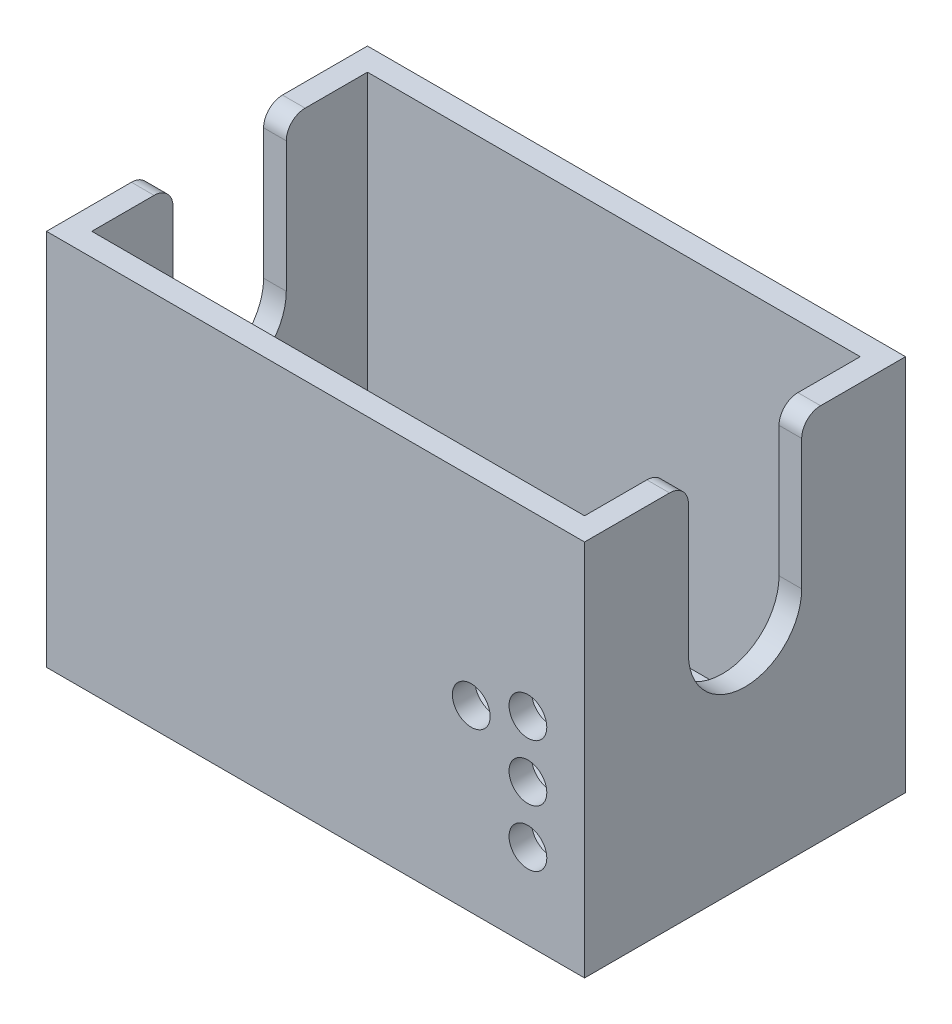
ISO-10303-21;
HEADER;
FILE_DESCRIPTION(('STEP AP214'),'2;1');
FILE_NAME('part.step','',(''),(''),'','','');
FILE_SCHEMA(('AUTOMOTIVE_DESIGN { 1 0 10303 214 1 1 1 1 }'));
ENDSEC;
DATA;
#1=APPLICATION_CONTEXT('core data for automotive mechanical design processes');
#2=APPLICATION_PROTOCOL_DEFINITION('international standard','automotive_design',2000,#1);
#3=PRODUCT_CONTEXT('',#1,'mechanical');
#4=PRODUCT('Part','Part','',(#3));
#5=PRODUCT_RELATED_PRODUCT_CATEGORY('part','',(#4));
#6=PRODUCT_DEFINITION_FORMATION('','',#4);
#7=PRODUCT_DEFINITION_CONTEXT('part definition',#1,'design');
#8=PRODUCT_DEFINITION('design','',#6,#7);
#9=PRODUCT_DEFINITION_SHAPE('','',#8);
#10=(LENGTH_UNIT() NAMED_UNIT(*) SI_UNIT(.MILLI.,.METRE.));
#11=(NAMED_UNIT(*) PLANE_ANGLE_UNIT() SI_UNIT($,.RADIAN.));
#12=(NAMED_UNIT(*) SI_UNIT($,.STERADIAN.) SOLID_ANGLE_UNIT());
#13=UNCERTAINTY_MEASURE_WITH_UNIT(LENGTH_MEASURE(1.E-05),#10,'distance_accuracy_value','');
#14=(GEOMETRIC_REPRESENTATION_CONTEXT(3) GLOBAL_UNCERTAINTY_ASSIGNED_CONTEXT((#13)) GLOBAL_UNIT_ASSIGNED_CONTEXT((#10,
#11,#12)) REPRESENTATION_CONTEXT('',''));
#15=CARTESIAN_POINT('',(0.,0.,0.));
#16=DIRECTION('',(0.,0.,1.));
#17=DIRECTION('',(1.,0.,0.));
#18=AXIS2_PLACEMENT_3D('',#15,#16,#17);
#19=CARTESIAN_POINT('',(0.,200.,0.));
#20=DIRECTION('',(0.,-1.,0.));
#21=DIRECTION('',(0.,0.,-1.));
#22=AXIS2_PLACEMENT_3D('',#19,#20,#21);
#23=PLANE('',#22);
#24=DIRECTION('',(1.,0.,0.));
#25=VECTOR('',#24,1.);
#26=CARTESIAN_POINT('',(-142.5,200.,40.0000000000001));
#27=LINE('',#26,#25);
#28=CARTESIAN_POINT('',(-142.5,200.,40.0000000000001));
#29=VERTEX_POINT('',#28);
#30=CARTESIAN_POINT('',(-130.5,200.,40.0000000000001));
#31=VERTEX_POINT('',#30);
#32=EDGE_CURVE('E291',#29,#31,#27,.T.);
#33=ORIENTED_EDGE('',*,*,#32,.F.);
#34=DIRECTION('',(0.,0.,1.));
#35=VECTOR('',#34,1.);
#36=CARTESIAN_POINT('',(-142.5,200.,-85.));
#37=LINE('',#36,#35);
#38=CARTESIAN_POINT('',(-142.5,200.,85.));
#39=VERTEX_POINT('',#38);
#40=EDGE_CURVE('E204',#29,#39,#37,.T.);
#41=ORIENTED_EDGE('',*,*,#40,.T.);
#42=DIRECTION('',(1.,0.,0.));
#43=VECTOR('',#42,1.);
#44=CARTESIAN_POINT('',(142.5,200.,84.9999999999999));
#45=LINE('',#44,#43);
#46=CARTESIAN_POINT('',(142.5,200.,84.9999999999999));
#47=VERTEX_POINT('',#46);
#48=EDGE_CURVE('E203',#39,#47,#45,.T.);
#49=ORIENTED_EDGE('',*,*,#48,.T.);
#50=DIRECTION('',(0.,0.,-1.));
#51=VECTOR('',#50,1.);
#52=CARTESIAN_POINT('',(142.5,200.,-85.0000000000001));
#53=LINE('',#52,#51);
#54=CARTESIAN_POINT('',(142.5,200.,40.));
#55=VERTEX_POINT('',#54);
#56=EDGE_CURVE('E208',#47,#55,#53,.T.);
#57=ORIENTED_EDGE('',*,*,#56,.T.);
#58=CARTESIAN_POINT('',(130.5,200.,40.));
#59=VERTEX_POINT('',#58);
#60=EDGE_CURVE('E289',#59,#55,#27,.T.);
#61=ORIENTED_EDGE('',*,*,#60,.F.);
#62=DIRECTION('',(0.,0.,-1.));
#63=VECTOR('',#62,1.);
#64=CARTESIAN_POINT('',(130.5,200.,0.));
#65=LINE('',#64,#63);
#66=CARTESIAN_POINT('',(130.5,200.,72.9999999999999));
#67=VERTEX_POINT('',#66);
#68=EDGE_CURVE('E179',#67,#59,#65,.T.);
#69=ORIENTED_EDGE('',*,*,#68,.F.);
#70=DIRECTION('',(1.,0.,0.));
#71=VECTOR('',#70,1.);
#72=CARTESIAN_POINT('',(0.,200.,73.));
#73=LINE('',#72,#71);
#74=CARTESIAN_POINT('',(-130.5,200.,73.));
#75=VERTEX_POINT('',#74);
#76=EDGE_CURVE('E180',#75,#67,#73,.T.);
#77=ORIENTED_EDGE('',*,*,#76,.F.);
#78=DIRECTION('',(0.,0.,1.));
#79=VECTOR('',#78,1.);
#80=CARTESIAN_POINT('',(-130.5,200.,0.));
#81=LINE('',#80,#79);
#82=EDGE_CURVE('E277',#31,#75,#81,.T.);
#83=ORIENTED_EDGE('',*,*,#82,.F.);
#84=EDGE_LOOP('',(#33,#41,#49,#57,#61,#69,#77,#83));
#85=FACE_BOUND('',#84,.T.);
#86=ADVANCED_FACE('F36',(#85),#23,.F.);
#87=DIRECTION('',(1.,0.,0.));
#88=VECTOR('',#87,1.);
#89=CARTESIAN_POINT('',(-142.5,200.,-40.0000000000001));
#90=LINE('',#89,#88);
#91=CARTESIAN_POINT('',(130.5,200.,-40.0000000000002));
#92=VERTEX_POINT('',#91);
#93=CARTESIAN_POINT('',(142.5,200.,-40.0000000000002));
#94=VERTEX_POINT('',#93);
#95=EDGE_CURVE('E294',#92,#94,#90,.T.);
#96=ORIENTED_EDGE('',*,*,#95,.T.);
#97=CARTESIAN_POINT('',(142.5,200.,-85.0000000000001));
#98=VERTEX_POINT('',#97);
#99=EDGE_CURVE('E206',#94,#98,#53,.T.);
#100=ORIENTED_EDGE('',*,*,#99,.T.);
#101=DIRECTION('',(-1.,0.,0.));
#102=VECTOR('',#101,1.);
#103=CARTESIAN_POINT('',(142.5,200.,-85.0000000000001));
#104=LINE('',#103,#102);
#105=CARTESIAN_POINT('',(-142.5,200.,-85.));
#106=VERTEX_POINT('',#105);
#107=EDGE_CURVE('E209',#98,#106,#104,.T.);
#108=ORIENTED_EDGE('',*,*,#107,.T.);
#109=CARTESIAN_POINT('',(-142.5,200.,-40.0000000000001));
#110=VERTEX_POINT('',#109);
#111=EDGE_CURVE('E200',#106,#110,#37,.T.);
#112=ORIENTED_EDGE('',*,*,#111,.T.);
#113=CARTESIAN_POINT('',(-130.5,200.,-40.0000000000001));
#114=VERTEX_POINT('',#113);
#115=EDGE_CURVE('E292',#110,#114,#90,.T.);
#116=ORIENTED_EDGE('',*,*,#115,.T.);
#117=CARTESIAN_POINT('',(-130.5,200.,-73.));
#118=VERTEX_POINT('',#117);
#119=EDGE_CURVE('E195',#118,#114,#81,.T.);
#120=ORIENTED_EDGE('',*,*,#119,.F.);
#121=DIRECTION('',(-1.,0.,0.));
#122=VECTOR('',#121,1.);
#123=CARTESIAN_POINT('',(0.,200.,-73.));
#124=LINE('',#123,#122);
#125=CARTESIAN_POINT('',(130.5,200.,-73.0000000000001));
#126=VERTEX_POINT('',#125);
#127=EDGE_CURVE('E185',#126,#118,#124,.T.);
#128=ORIENTED_EDGE('',*,*,#127,.F.);
#129=EDGE_CURVE('E168',#92,#126,#65,.T.);
#130=ORIENTED_EDGE('',*,*,#129,.F.);
#131=EDGE_LOOP('',(#96,#100,#108,#112,#116,#120,#128,#130));
#132=FACE_BOUND('',#131,.T.);
#133=ADVANCED_FACE('F192',(#132),#23,.F.);
#134=CARTESIAN_POINT('',(-142.5,200.,-85.));
#135=DIRECTION('',(1.,0.,0.));
#136=DIRECTION('',(0.,0.,-1.));
#137=AXIS2_PLACEMENT_3D('',#134,#135,#136);
#138=PLANE('',#137);
#139=CARTESIAN_POINT('',(-142.5,190.,40.));
#140=DIRECTION('',(1.,0.,0.));
#141=DIRECTION('',(0.,0.,-1.));
#142=AXIS2_PLACEMENT_3D('',#139,#140,#141);
#143=CIRCLE('',#142,10.);
#144=CARTESIAN_POINT('',(-142.5,190.,30.));
#145=VERTEX_POINT('',#144);
#146=EDGE_CURVE('E407',#145,#29,#143,.T.);
#147=ORIENTED_EDGE('',*,*,#146,.F.);
#148=DIRECTION('',(0.,1.,0.));
#149=VECTOR('',#148,1.);
#150=CARTESIAN_POINT('',(-142.5,0.,30.));
#151=LINE('',#150,#149);
#152=CARTESIAN_POINT('',(-142.5,121.,30.));
#153=VERTEX_POINT('',#152);
#154=EDGE_CURVE('E405',#153,#145,#151,.T.);
#155=ORIENTED_EDGE('',*,*,#154,.F.);
#156=CARTESIAN_POINT('',(-142.5,121.,0.));
#157=DIRECTION('',(1.,0.,0.));
#158=DIRECTION('',(0.,0.,-1.));
#159=AXIS2_PLACEMENT_3D('',#156,#157,#158);
#160=CIRCLE('',#159,30.);
#161=CARTESIAN_POINT('',(-142.5,121.,-30.));
#162=VERTEX_POINT('',#161);
#163=EDGE_CURVE('E406',#153,#162,#160,.T.);
#164=ORIENTED_EDGE('',*,*,#163,.T.);
#165=DIRECTION('',(0.,1.,0.));
#166=VECTOR('',#165,1.);
#167=CARTESIAN_POINT('',(-142.5,0.,-29.9999999999998));
#168=LINE('',#167,#166);
#169=CARTESIAN_POINT('',(-142.5,190.,-30.));
#170=VERTEX_POINT('',#169);
#171=EDGE_CURVE('E326',#162,#170,#168,.T.);
#172=ORIENTED_EDGE('',*,*,#171,.T.);
#173=CARTESIAN_POINT('',(-142.5,190.,-40.));
#174=DIRECTION('',(1.,0.,0.));
#175=DIRECTION('',(0.,0.,-1.));
#176=AXIS2_PLACEMENT_3D('',#173,#174,#175);
#177=CIRCLE('',#176,10.);
#178=EDGE_CURVE('E397',#170,#110,#177,.F.);
#179=ORIENTED_EDGE('',*,*,#178,.T.);
#180=ORIENTED_EDGE('',*,*,#111,.F.);
#181=DIRECTION('',(0.,-1.,0.));
#182=VECTOR('',#181,1.);
#183=CARTESIAN_POINT('',(-142.5,200.,-85.));
#184=LINE('',#183,#182);
#185=CARTESIAN_POINT('',(-142.5,0.,-85.));
#186=VERTEX_POINT('',#185);
#187=EDGE_CURVE('E211',#106,#186,#184,.T.);
#188=ORIENTED_EDGE('',*,*,#187,.T.);
#189=DIRECTION('',(0.,0.,1.));
#190=VECTOR('',#189,1.);
#191=CARTESIAN_POINT('',(-142.5,0.,-85.));
#192=LINE('',#191,#190);
#193=CARTESIAN_POINT('',(-142.5,0.,85.));
#194=VERTEX_POINT('',#193);
#195=EDGE_CURVE('E212',#186,#194,#192,.T.);
#196=ORIENTED_EDGE('',*,*,#195,.T.);
#197=DIRECTION('',(0.,-1.,0.));
#198=VECTOR('',#197,1.);
#199=CARTESIAN_POINT('',(-142.5,200.,85.));
#200=LINE('',#199,#198);
#201=EDGE_CURVE('E230',#39,#194,#200,.T.);
#202=ORIENTED_EDGE('',*,*,#201,.F.);
#203=ORIENTED_EDGE('',*,*,#40,.F.);
#204=EDGE_LOOP('',(#147,#155,#164,#172,#179,#180,#188,#196,#202,#203));
#205=FACE_BOUND('',#204,.T.);
#206=ADVANCED_FACE('F38',(#205),#138,.F.);
#207=CARTESIAN_POINT('',(142.5,200.,-85.0000000000001));
#208=DIRECTION('',(-1.,0.,0.));
#209=DIRECTION('',(0.,0.,1.));
#210=AXIS2_PLACEMENT_3D('',#207,#208,#209);
#211=PLANE('',#210);
#212=CARTESIAN_POINT('',(142.5,190.,40.));
#213=DIRECTION('',(1.,0.,0.));
#214=DIRECTION('',(0.,0.,-1.));
#215=AXIS2_PLACEMENT_3D('',#212,#213,#214);
#216=CIRCLE('',#215,10.);
#217=CARTESIAN_POINT('',(142.5,190.,30.));
#218=VERTEX_POINT('',#217);
#219=EDGE_CURVE('E40',#218,#55,#216,.T.);
#220=ORIENTED_EDGE('',*,*,#219,.T.);
#221=ORIENTED_EDGE('',*,*,#56,.F.);
#222=DIRECTION('',(0.,-1.,0.));
#223=VECTOR('',#222,1.);
#224=CARTESIAN_POINT('',(142.5,200.,84.9999999999999));
#225=LINE('',#224,#223);
#226=CARTESIAN_POINT('',(142.5,0.,84.9999999999999));
#227=VERTEX_POINT('',#226);
#228=EDGE_CURVE('E227',#47,#227,#225,.T.);
#229=ORIENTED_EDGE('',*,*,#228,.T.);
#230=DIRECTION('',(0.,0.,-1.));
#231=VECTOR('',#230,1.);
#232=CARTESIAN_POINT('',(142.5,0.,-85.0000000000001));
#233=LINE('',#232,#231);
#234=CARTESIAN_POINT('',(142.5,0.,-85.0000000000001));
#235=VERTEX_POINT('',#234);
#236=EDGE_CURVE('E218',#227,#235,#233,.T.);
#237=ORIENTED_EDGE('',*,*,#236,.T.);
#238=DIRECTION('',(0.,-1.,0.));
#239=VECTOR('',#238,1.);
#240=CARTESIAN_POINT('',(142.5,200.,-85.0000000000001));
#241=LINE('',#240,#239);
#242=EDGE_CURVE('E224',#98,#235,#241,.T.);
#243=ORIENTED_EDGE('',*,*,#242,.F.);
#244=ORIENTED_EDGE('',*,*,#99,.F.);
#245=CARTESIAN_POINT('',(142.5,190.,-40.0000000000001));
#246=DIRECTION('',(1.,0.,0.));
#247=DIRECTION('',(0.,0.,-1.));
#248=AXIS2_PLACEMENT_3D('',#245,#246,#247);
#249=CIRCLE('',#248,10.);
#250=CARTESIAN_POINT('',(142.5,190.,-30.0000000000001));
#251=VERTEX_POINT('',#250);
#252=EDGE_CURVE('E250',#251,#94,#249,.F.);
#253=ORIENTED_EDGE('',*,*,#252,.F.);
#254=DIRECTION('',(0.,1.,0.));
#255=VECTOR('',#254,1.);
#256=CARTESIAN_POINT('',(142.5,0.,-29.9999999999999));
#257=LINE('',#256,#255);
#258=CARTESIAN_POINT('',(142.5,121.,-30.));
#259=VERTEX_POINT('',#258);
#260=EDGE_CURVE('E248',#259,#251,#257,.T.);
#261=ORIENTED_EDGE('',*,*,#260,.F.);
#262=CARTESIAN_POINT('',(142.5,121.,0.));
#263=DIRECTION('',(1.,0.,0.));
#264=DIRECTION('',(0.,0.,-1.));
#265=AXIS2_PLACEMENT_3D('',#262,#263,#264);
#266=CIRCLE('',#265,30.);
#267=CARTESIAN_POINT('',(142.5,121.,30.));
#268=VERTEX_POINT('',#267);
#269=EDGE_CURVE('E245',#268,#259,#266,.T.);
#270=ORIENTED_EDGE('',*,*,#269,.F.);
#271=DIRECTION('',(0.,1.,0.));
#272=VECTOR('',#271,1.);
#273=CARTESIAN_POINT('',(142.5,200.,29.9999999999999));
#274=LINE('',#273,#272);
#275=EDGE_CURVE('E240',#268,#218,#274,.T.);
#276=ORIENTED_EDGE('',*,*,#275,.T.);
#277=EDGE_LOOP('',(#220,#221,#229,#237,#243,#244,#253,#261,#270,#276));
#278=FACE_BOUND('',#277,.T.);
#279=ADVANCED_FACE('F358',(#278),#211,.F.);
#280=CARTESIAN_POINT('',(-130.5,200.,-85.));
#281=DIRECTION('',(1.,0.,0.));
#282=DIRECTION('',(0.,0.,-1.));
#283=AXIS2_PLACEMENT_3D('',#280,#281,#282);
#284=PLANE('',#283);
#285=DIRECTION('',(0.,1.,0.));
#286=VECTOR('',#285,1.);
#287=CARTESIAN_POINT('',(-130.5,200.,30.0000000000001));
#288=LINE('',#287,#286);
#289=CARTESIAN_POINT('',(-130.5,121.,30.));
#290=VERTEX_POINT('',#289);
#291=CARTESIAN_POINT('',(-130.5,190.,30.0000000000001));
#292=VERTEX_POINT('',#291);
#293=EDGE_CURVE('E244',#290,#292,#288,.T.);
#294=ORIENTED_EDGE('',*,*,#293,.T.);
#295=CARTESIAN_POINT('',(-130.5,190.,40.));
#296=DIRECTION('',(1.,0.,0.));
#297=DIRECTION('',(0.,0.,-1.));
#298=AXIS2_PLACEMENT_3D('',#295,#296,#297);
#299=CIRCLE('',#298,10.);
#300=EDGE_CURVE('E251',#292,#31,#299,.T.);
#301=ORIENTED_EDGE('',*,*,#300,.T.);
#302=ORIENTED_EDGE('',*,*,#82,.T.);
#303=DIRECTION('',(0.,-1.,0.));
#304=VECTOR('',#303,1.);
#305=CARTESIAN_POINT('',(-130.5,200.,73.));
#306=LINE('',#305,#304);
#307=CARTESIAN_POINT('',(-130.5,12.,73.));
#308=VERTEX_POINT('',#307);
#309=EDGE_CURVE('E216',#75,#308,#306,.T.);
#310=ORIENTED_EDGE('',*,*,#309,.T.);
#311=DIRECTION('',(0.,0.,1.));
#312=VECTOR('',#311,1.);
#313=CARTESIAN_POINT('',(-130.5,12.,0.));
#314=LINE('',#313,#312);
#315=CARTESIAN_POINT('',(-130.5,12.,-73.));
#316=VERTEX_POINT('',#315);
#317=EDGE_CURVE('E265',#316,#308,#314,.T.);
#318=ORIENTED_EDGE('',*,*,#317,.F.);
#319=DIRECTION('',(0.,-1.,0.));
#320=VECTOR('',#319,1.);
#321=CARTESIAN_POINT('',(-130.5,200.,-73.));
#322=LINE('',#321,#320);
#323=EDGE_CURVE('E189',#118,#316,#322,.T.);
#324=ORIENTED_EDGE('',*,*,#323,.F.);
#325=ORIENTED_EDGE('',*,*,#119,.T.);
#326=CARTESIAN_POINT('',(-130.5,190.,-40.));
#327=DIRECTION('',(1.,0.,0.));
#328=DIRECTION('',(0.,0.,-1.));
#329=AXIS2_PLACEMENT_3D('',#326,#327,#328);
#330=CIRCLE('',#329,10.);
#331=CARTESIAN_POINT('',(-130.5,190.,-30.));
#332=VERTEX_POINT('',#331);
#333=EDGE_CURVE('E249',#332,#114,#330,.F.);
#334=ORIENTED_EDGE('',*,*,#333,.F.);
#335=DIRECTION('',(0.,1.,0.));
#336=VECTOR('',#335,1.);
#337=CARTESIAN_POINT('',(-130.5,200.,-30.));
#338=LINE('',#337,#336);
#339=CARTESIAN_POINT('',(-130.5,121.,-30.));
#340=VERTEX_POINT('',#339);
#341=EDGE_CURVE('E247',#340,#332,#338,.T.);
#342=ORIENTED_EDGE('',*,*,#341,.F.);
#343=CARTESIAN_POINT('',(-130.5,121.,0.));
#344=DIRECTION('',(1.,0.,0.));
#345=DIRECTION('',(0.,0.,-1.));
#346=AXIS2_PLACEMENT_3D('',#343,#344,#345);
#347=CIRCLE('',#346,30.);
#348=EDGE_CURVE('E243',#290,#340,#347,.T.);
#349=ORIENTED_EDGE('',*,*,#348,.F.);
#350=EDGE_LOOP('',(#294,#301,#302,#310,#318,#324,#325,#334,#342,#349));
#351=FACE_BOUND('',#350,.T.);
#352=ADVANCED_FACE('F328',(#351),#284,.T.);
#353=CARTESIAN_POINT('',(130.5,200.,-85.0000000000001));
#354=DIRECTION('',(-1.,0.,0.));
#355=DIRECTION('',(0.,0.,1.));
#356=AXIS2_PLACEMENT_3D('',#353,#354,#355);
#357=PLANE('',#356);
#358=ORIENTED_EDGE('',*,*,#68,.T.);
#359=CARTESIAN_POINT('',(130.5,190.,40.));
#360=DIRECTION('',(-1.,0.,0.));
#361=DIRECTION('',(0.,0.,1.));
#362=AXIS2_PLACEMENT_3D('',#359,#360,#361);
#363=CIRCLE('',#362,10.);
#364=CARTESIAN_POINT('',(130.5,190.,30.));
#365=VERTEX_POINT('',#364);
#366=EDGE_CURVE('E11',#59,#365,#363,.T.);
#367=ORIENTED_EDGE('',*,*,#366,.T.);
#368=DIRECTION('',(0.,-1.,0.));
#369=VECTOR('',#368,1.);
#370=CARTESIAN_POINT('',(130.5,200.,30.));
#371=LINE('',#370,#369);
#372=CARTESIAN_POINT('',(130.5,121.,30.));
#373=VERTEX_POINT('',#372);
#374=EDGE_CURVE('E94',#365,#373,#371,.T.);
#375=ORIENTED_EDGE('',*,*,#374,.T.);
#376=CARTESIAN_POINT('',(130.5,121.,0.));
#377=DIRECTION('',(-1.,0.,0.));
#378=DIRECTION('',(0.,0.,1.));
#379=AXIS2_PLACEMENT_3D('',#376,#377,#378);
#380=CIRCLE('',#379,30.);
#381=CARTESIAN_POINT('',(130.5,121.,-30.));
#382=VERTEX_POINT('',#381);
#383=EDGE_CURVE('E234',#382,#373,#380,.T.);
#384=ORIENTED_EDGE('',*,*,#383,.F.);
#385=DIRECTION('',(0.,-1.,0.));
#386=VECTOR('',#385,1.);
#387=CARTESIAN_POINT('',(130.5,200.,-30.0000000000001));
#388=LINE('',#387,#386);
#389=CARTESIAN_POINT('',(130.5,190.,-30.0000000000001));
#390=VERTEX_POINT('',#389);
#391=EDGE_CURVE('E237',#390,#382,#388,.T.);
#392=ORIENTED_EDGE('',*,*,#391,.F.);
#393=CARTESIAN_POINT('',(130.5,190.,-40.0000000000001));
#394=DIRECTION('',(-1.,0.,0.));
#395=DIRECTION('',(0.,0.,1.));
#396=AXIS2_PLACEMENT_3D('',#393,#394,#395);
#397=CIRCLE('',#396,10.);
#398=EDGE_CURVE('E46',#92,#390,#397,.F.);
#399=ORIENTED_EDGE('',*,*,#398,.F.);
#400=ORIENTED_EDGE('',*,*,#129,.T.);
#401=DIRECTION('',(0.,-1.,0.));
#402=VECTOR('',#401,1.);
#403=CARTESIAN_POINT('',(130.5,200.,-73.0000000000001));
#404=LINE('',#403,#402);
#405=CARTESIAN_POINT('',(130.5,12.,-73.0000000000001));
#406=VERTEX_POINT('',#405);
#407=EDGE_CURVE('E173',#126,#406,#404,.T.);
#408=ORIENTED_EDGE('',*,*,#407,.T.);
#409=DIRECTION('',(0.,0.,-1.));
#410=VECTOR('',#409,1.);
#411=CARTESIAN_POINT('',(130.5,12.,0.));
#412=LINE('',#411,#410);
#413=CARTESIAN_POINT('',(130.5,12.,72.9999999999999));
#414=VERTEX_POINT('',#413);
#415=EDGE_CURVE('E272',#414,#406,#412,.T.);
#416=ORIENTED_EDGE('',*,*,#415,.F.);
#417=DIRECTION('',(0.,-1.,0.));
#418=VECTOR('',#417,1.);
#419=CARTESIAN_POINT('',(130.5,200.,72.9999999999999));
#420=LINE('',#419,#418);
#421=EDGE_CURVE('E188',#67,#414,#420,.T.);
#422=ORIENTED_EDGE('',*,*,#421,.F.);
#423=EDGE_LOOP('',(#358,#367,#375,#384,#392,#399,#400,#408,#416,#422));
#424=FACE_BOUND('',#423,.T.);
#425=ADVANCED_FACE('F171',(#424),#357,.T.);
#426=CARTESIAN_POINT('',(142.5,200.,84.9999999999999));
#427=DIRECTION('',(0.,0.,-1.));
#428=DIRECTION('',(-1.,0.,0.));
#429=AXIS2_PLACEMENT_3D('',#426,#427,#428);
#430=PLANE('',#429);
#431=CARTESIAN_POINT('',(82.5,95.,84.9999999999999));
#432=DIRECTION('',(0.,0.,1.));
#433=DIRECTION('',(1.,0.,0.));
#434=AXIS2_PLACEMENT_3D('',#431,#432,#433);
#435=CIRCLE('',#434,9.99999999999999);
#436=CARTESIAN_POINT('',(92.5,95.,84.9999999999999));
#437=VERTEX_POINT('',#436);
#438=EDGE_CURVE('E370',#437,#437,#435,.T.);
#439=ORIENTED_EDGE('',*,*,#438,.F.);
#440=EDGE_LOOP('',(#439));
#441=FACE_BOUND('',#440,.T.);
#442=CARTESIAN_POINT('',(112.5,45.,84.9999999999999));
#443=DIRECTION('',(0.,0.,1.));
#444=DIRECTION('',(1.,0.,0.));
#445=AXIS2_PLACEMENT_3D('',#442,#443,#444);
#446=CIRCLE('',#445,9.99999999999999);
#447=CARTESIAN_POINT('',(122.5,45.,84.9999999999999));
#448=VERTEX_POINT('',#447);
#449=EDGE_CURVE('E374',#448,#448,#446,.T.);
#450=ORIENTED_EDGE('',*,*,#449,.F.);
#451=EDGE_LOOP('',(#450));
#452=FACE_BOUND('',#451,.T.);
#453=CARTESIAN_POINT('',(112.5,75.,84.9999999999999));
#454=DIRECTION('',(0.,0.,1.));
#455=DIRECTION('',(1.,0.,0.));
#456=AXIS2_PLACEMENT_3D('',#453,#454,#455);
#457=CIRCLE('',#456,9.99999999999999);
#458=CARTESIAN_POINT('',(122.5,75.,84.9999999999999));
#459=VERTEX_POINT('',#458);
#460=EDGE_CURVE('E378',#459,#459,#457,.T.);
#461=ORIENTED_EDGE('',*,*,#460,.F.);
#462=EDGE_LOOP('',(#461));
#463=FACE_BOUND('',#462,.T.);
#464=CARTESIAN_POINT('',(112.5,105.,84.9999999999999));
#465=DIRECTION('',(0.,0.,1.));
#466=DIRECTION('',(1.,0.,0.));
#467=AXIS2_PLACEMENT_3D('',#464,#465,#466);
#468=CIRCLE('',#467,9.99999999999999);
#469=CARTESIAN_POINT('',(122.5,105.,84.9999999999999));
#470=VERTEX_POINT('',#469);
#471=EDGE_CURVE('E382',#470,#470,#468,.T.);
#472=ORIENTED_EDGE('',*,*,#471,.F.);
#473=EDGE_LOOP('',(#472));
#474=FACE_BOUND('',#473,.T.);
#475=DIRECTION('',(1.,0.,0.));
#476=VECTOR('',#475,1.);
#477=CARTESIAN_POINT('',(142.5,0.,84.9999999999999));
#478=LINE('',#477,#476);
#479=EDGE_CURVE('E215',#194,#227,#478,.T.);
#480=ORIENTED_EDGE('',*,*,#479,.T.);
#481=ORIENTED_EDGE('',*,*,#228,.F.);
#482=ORIENTED_EDGE('',*,*,#48,.F.);
#483=ORIENTED_EDGE('',*,*,#201,.T.);
#484=EDGE_LOOP('',(#480,#481,#482,#483));
#485=FACE_BOUND('',#484,.T.);
#486=ADVANCED_FACE('F356',(#441,#452,#463,#474,#485),#430,.F.);
#487=CARTESIAN_POINT('',(142.5,200.,-85.0000000000001));
#488=DIRECTION('',(0.,0.,1.));
#489=DIRECTION('',(1.,0.,0.));
#490=AXIS2_PLACEMENT_3D('',#487,#488,#489);
#491=PLANE('',#490);
#492=DIRECTION('',(-1.,0.,0.));
#493=VECTOR('',#492,1.);
#494=CARTESIAN_POINT('',(142.5,0.,-85.0000000000001));
#495=LINE('',#494,#493);
#496=EDGE_CURVE('E220',#235,#186,#495,.T.);
#497=ORIENTED_EDGE('',*,*,#496,.T.);
#498=ORIENTED_EDGE('',*,*,#187,.F.);
#499=ORIENTED_EDGE('',*,*,#107,.F.);
#500=ORIENTED_EDGE('',*,*,#242,.T.);
#501=EDGE_LOOP('',(#497,#498,#499,#500));
#502=FACE_BOUND('',#501,.T.);
#503=ADVANCED_FACE('F352',(#502),#491,.F.);
#504=CARTESIAN_POINT('',(0.,0.,0.));
#505=DIRECTION('',(0.,-1.,0.));
#506=DIRECTION('',(0.,0.,-1.));
#507=AXIS2_PLACEMENT_3D('',#504,#505,#506);
#508=PLANE('',#507);
#509=ORIENTED_EDGE('',*,*,#195,.F.);
#510=ORIENTED_EDGE('',*,*,#496,.F.);
#511=ORIENTED_EDGE('',*,*,#236,.F.);
#512=ORIENTED_EDGE('',*,*,#479,.F.);
#513=EDGE_LOOP('',(#509,#510,#511,#512));
#514=FACE_BOUND('',#513,.T.);
#515=ADVANCED_FACE('F349',(#514),#508,.T.);
#516=CARTESIAN_POINT('',(142.5,200.,72.9999999999999));
#517=DIRECTION('',(0.,0.,-1.));
#518=DIRECTION('',(-1.,0.,0.));
#519=AXIS2_PLACEMENT_3D('',#516,#517,#518);
#520=PLANE('',#519);
#521=CARTESIAN_POINT('',(82.5,95.,72.9999999999999));
#522=DIRECTION('',(0.,0.,-1.));
#523=DIRECTION('',(-1.,0.,0.));
#524=AXIS2_PLACEMENT_3D('',#521,#522,#523);
#525=CIRCLE('',#524,9.99999999999999);
#526=CARTESIAN_POINT('',(72.5,95.,72.9999999999999));
#527=VERTEX_POINT('',#526);
#528=EDGE_CURVE('E450',#527,#527,#525,.F.);
#529=ORIENTED_EDGE('',*,*,#528,.T.);
#530=EDGE_LOOP('',(#529));
#531=FACE_BOUND('',#530,.T.);
#532=CARTESIAN_POINT('',(112.5,45.,72.9999999999999));
#533=DIRECTION('',(0.,0.,-1.));
#534=DIRECTION('',(-1.,0.,0.));
#535=AXIS2_PLACEMENT_3D('',#532,#533,#534);
#536=CIRCLE('',#535,9.99999999999999);
#537=CARTESIAN_POINT('',(102.5,45.,72.9999999999999));
#538=VERTEX_POINT('',#537);
#539=EDGE_CURVE('E454',#538,#538,#536,.F.);
#540=ORIENTED_EDGE('',*,*,#539,.T.);
#541=EDGE_LOOP('',(#540));
#542=FACE_BOUND('',#541,.T.);
#543=CARTESIAN_POINT('',(112.5,75.,72.9999999999999));
#544=DIRECTION('',(0.,0.,-1.));
#545=DIRECTION('',(-1.,0.,0.));
#546=AXIS2_PLACEMENT_3D('',#543,#544,#545);
#547=CIRCLE('',#546,9.99999999999999);
#548=CARTESIAN_POINT('',(102.5,75.,72.9999999999999));
#549=VERTEX_POINT('',#548);
#550=EDGE_CURVE('E458',#549,#549,#547,.F.);
#551=ORIENTED_EDGE('',*,*,#550,.T.);
#552=EDGE_LOOP('',(#551));
#553=FACE_BOUND('',#552,.T.);
#554=CARTESIAN_POINT('',(112.5,105.,72.9999999999999));
#555=DIRECTION('',(0.,0.,-1.));
#556=DIRECTION('',(-1.,0.,0.));
#557=AXIS2_PLACEMENT_3D('',#554,#555,#556);
#558=CIRCLE('',#557,9.99999999999999);
#559=CARTESIAN_POINT('',(102.5,105.,72.9999999999999));
#560=VERTEX_POINT('',#559);
#561=EDGE_CURVE('E412',#560,#560,#558,.F.);
#562=ORIENTED_EDGE('',*,*,#561,.T.);
#563=EDGE_LOOP('',(#562));
#564=FACE_BOUND('',#563,.T.);
#565=DIRECTION('',(1.,0.,0.));
#566=VECTOR('',#565,1.);
#567=CARTESIAN_POINT('',(0.,12.,73.));
#568=LINE('',#567,#566);
#569=EDGE_CURVE('E268',#308,#414,#568,.T.);
#570=ORIENTED_EDGE('',*,*,#569,.F.);
#571=ORIENTED_EDGE('',*,*,#309,.F.);
#572=ORIENTED_EDGE('',*,*,#76,.T.);
#573=ORIENTED_EDGE('',*,*,#421,.T.);
#574=EDGE_LOOP('',(#570,#571,#572,#573));
#575=FACE_BOUND('',#574,.T.);
#576=ADVANCED_FACE('F282',(#531,#542,#553,#564,#575),#520,.T.);
#577=CARTESIAN_POINT('',(142.5,200.,-73.0000000000001));
#578=DIRECTION('',(0.,0.,1.));
#579=DIRECTION('',(1.,0.,0.));
#580=AXIS2_PLACEMENT_3D('',#577,#578,#579);
#581=PLANE('',#580);
#582=DIRECTION('',(-1.,0.,0.));
#583=VECTOR('',#582,1.);
#584=CARTESIAN_POINT('',(0.,12.,-73.));
#585=LINE('',#584,#583);
#586=EDGE_CURVE('E187',#406,#316,#585,.T.);
#587=ORIENTED_EDGE('',*,*,#586,.F.);
#588=ORIENTED_EDGE('',*,*,#407,.F.);
#589=ORIENTED_EDGE('',*,*,#127,.T.);
#590=ORIENTED_EDGE('',*,*,#323,.T.);
#591=EDGE_LOOP('',(#587,#588,#589,#590));
#592=FACE_BOUND('',#591,.T.);
#593=ADVANCED_FACE('F183',(#592),#581,.T.);
#594=CARTESIAN_POINT('',(0.,12.,0.));
#595=DIRECTION('',(0.,-1.,0.));
#596=DIRECTION('',(0.,0.,-1.));
#597=AXIS2_PLACEMENT_3D('',#594,#595,#596);
#598=PLANE('',#597);
#599=ORIENTED_EDGE('',*,*,#317,.T.);
#600=ORIENTED_EDGE('',*,*,#569,.T.);
#601=ORIENTED_EDGE('',*,*,#415,.T.);
#602=ORIENTED_EDGE('',*,*,#586,.T.);
#603=EDGE_LOOP('',(#599,#600,#601,#602));
#604=FACE_BOUND('',#603,.T.);
#605=ADVANCED_FACE('F331',(#604),#598,.F.);
#606=CARTESIAN_POINT('',(-142.5,0.,30.));
#607=DIRECTION('',(0.,0.,-1.));
#608=DIRECTION('',(-1.,0.,0.));
#609=AXIS2_PLACEMENT_3D('',#606,#607,#608);
#610=PLANE('',#609);
#611=ORIENTED_EDGE('',*,*,#275,.F.);
#612=DIRECTION('',(1.,0.,0.));
#613=VECTOR('',#612,1.);
#614=CARTESIAN_POINT('',(-142.5,121.,30.));
#615=LINE('',#614,#613);
#616=EDGE_CURVE('E299',#373,#268,#615,.T.);
#617=ORIENTED_EDGE('',*,*,#616,.F.);
#618=ORIENTED_EDGE('',*,*,#374,.F.);
#619=DIRECTION('',(1.,0.,0.));
#620=VECTOR('',#619,1.);
#621=CARTESIAN_POINT('',(-142.5,190.,30.));
#622=LINE('',#621,#620);
#623=EDGE_CURVE('E300',#365,#218,#622,.T.);
#624=ORIENTED_EDGE('',*,*,#623,.T.);
#625=EDGE_LOOP('',(#611,#617,#618,#624));
#626=FACE_BOUND('',#625,.T.);
#627=ADVANCED_FACE('F333',(#626),#610,.T.);
#628=CARTESIAN_POINT('',(-142.5,121.,0.));
#629=DIRECTION('',(1.,0.,0.));
#630=DIRECTION('',(0.,0.,-1.));
#631=AXIS2_PLACEMENT_3D('',#628,#629,#630);
#632=CYLINDRICAL_SURFACE('',#631,30.);
#633=DIRECTION('',(1.,0.,0.));
#634=VECTOR('',#633,1.);
#635=CARTESIAN_POINT('',(-142.5,121.,-30.));
#636=LINE('',#635,#634);
#637=EDGE_CURVE('E307',#382,#259,#636,.T.);
#638=ORIENTED_EDGE('',*,*,#637,.F.);
#639=ORIENTED_EDGE('',*,*,#383,.T.);
#640=ORIENTED_EDGE('',*,*,#616,.T.);
#641=ORIENTED_EDGE('',*,*,#269,.T.);
#642=EDGE_LOOP('',(#638,#639,#640,#641));
#643=FACE_BOUND('',#642,.T.);
#644=ADVANCED_FACE('F339',(#643),#632,.F.);
#645=CARTESIAN_POINT('',(-142.5,0.,-29.9999999999998));
#646=DIRECTION('',(0.,0.,-1.));
#647=DIRECTION('',(0.,1.,0.));
#648=AXIS2_PLACEMENT_3D('',#645,#646,#647);
#649=PLANE('',#648);
#650=DIRECTION('',(1.,0.,0.));
#651=VECTOR('',#650,1.);
#652=CARTESIAN_POINT('',(-142.5,190.,-30.));
#653=LINE('',#652,#651);
#654=EDGE_CURVE('E303',#390,#251,#653,.T.);
#655=ORIENTED_EDGE('',*,*,#654,.F.);
#656=ORIENTED_EDGE('',*,*,#391,.T.);
#657=ORIENTED_EDGE('',*,*,#637,.T.);
#658=ORIENTED_EDGE('',*,*,#260,.T.);
#659=EDGE_LOOP('',(#655,#656,#657,#658));
#660=FACE_BOUND('',#659,.T.);
#661=ADVANCED_FACE('F428',(#660),#649,.F.);
#662=CARTESIAN_POINT('',(-142.5,190.,-40.));
#663=DIRECTION('',(1.,0.,0.));
#664=DIRECTION('',(0.,0.,-1.));
#665=AXIS2_PLACEMENT_3D('',#662,#663,#664);
#666=CYLINDRICAL_SURFACE('',#665,10.);
#667=ORIENTED_EDGE('',*,*,#95,.F.);
#668=ORIENTED_EDGE('',*,*,#398,.T.);
#669=ORIENTED_EDGE('',*,*,#654,.T.);
#670=ORIENTED_EDGE('',*,*,#252,.T.);
#671=EDGE_LOOP('',(#667,#668,#669,#670));
#672=FACE_BOUND('',#671,.T.);
#673=ADVANCED_FACE('F431',(#672),#666,.T.);
#674=CARTESIAN_POINT('',(-142.5,190.,40.));
#675=DIRECTION('',(1.,0.,0.));
#676=DIRECTION('',(0.,0.,-1.));
#677=AXIS2_PLACEMENT_3D('',#674,#675,#676);
#678=CYLINDRICAL_SURFACE('',#677,10.);
#679=ORIENTED_EDGE('',*,*,#219,.F.);
#680=ORIENTED_EDGE('',*,*,#623,.F.);
#681=ORIENTED_EDGE('',*,*,#366,.F.);
#682=ORIENTED_EDGE('',*,*,#60,.T.);
#683=EDGE_LOOP('',(#679,#680,#681,#682));
#684=FACE_BOUND('',#683,.T.);
#685=ADVANCED_FACE('F429',(#684),#678,.T.);
#686=EDGE_CURVE('E55',#145,#292,#622,.T.);
#687=ORIENTED_EDGE('',*,*,#686,.F.);
#688=ORIENTED_EDGE('',*,*,#146,.T.);
#689=ORIENTED_EDGE('',*,*,#32,.T.);
#690=ORIENTED_EDGE('',*,*,#300,.F.);
#691=EDGE_LOOP('',(#687,#688,#689,#690));
#692=FACE_BOUND('',#691,.T.);
#693=ADVANCED_FACE('F410',(#692),#678,.T.);
#694=ORIENTED_EDGE('',*,*,#333,.T.);
#695=ORIENTED_EDGE('',*,*,#115,.F.);
#696=ORIENTED_EDGE('',*,*,#178,.F.);
#697=EDGE_CURVE('E301',#170,#332,#653,.T.);
#698=ORIENTED_EDGE('',*,*,#697,.T.);
#699=EDGE_LOOP('',(#694,#695,#696,#698));
#700=FACE_BOUND('',#699,.T.);
#701=ADVANCED_FACE('F437',(#700),#666,.T.);
#702=ORIENTED_EDGE('',*,*,#341,.T.);
#703=ORIENTED_EDGE('',*,*,#697,.F.);
#704=ORIENTED_EDGE('',*,*,#171,.F.);
#705=EDGE_CURVE('E304',#162,#340,#636,.T.);
#706=ORIENTED_EDGE('',*,*,#705,.T.);
#707=EDGE_LOOP('',(#702,#703,#704,#706));
#708=FACE_BOUND('',#707,.T.);
#709=ADVANCED_FACE('F323',(#708),#649,.F.);
#710=ORIENTED_EDGE('',*,*,#348,.T.);
#711=ORIENTED_EDGE('',*,*,#705,.F.);
#712=ORIENTED_EDGE('',*,*,#163,.F.);
#713=EDGE_CURVE('E308',#153,#290,#615,.T.);
#714=ORIENTED_EDGE('',*,*,#713,.T.);
#715=EDGE_LOOP('',(#710,#711,#712,#714));
#716=FACE_BOUND('',#715,.T.);
#717=ADVANCED_FACE('F315',(#716),#632,.F.);
#718=ORIENTED_EDGE('',*,*,#713,.F.);
#719=ORIENTED_EDGE('',*,*,#154,.T.);
#720=ORIENTED_EDGE('',*,*,#686,.T.);
#721=ORIENTED_EDGE('',*,*,#293,.F.);
#722=EDGE_LOOP('',(#718,#719,#720,#721));
#723=FACE_BOUND('',#722,.T.);
#724=ADVANCED_FACE('F341',(#723),#610,.T.);
#725=CARTESIAN_POINT('',(112.5,105.,44.715728752538));
#726=DIRECTION('',(0.,0.,1.));
#727=DIRECTION('',(1.,0.,0.));
#728=AXIS2_PLACEMENT_3D('',#725,#726,#727);
#729=CYLINDRICAL_SURFACE('',#728,9.99999999999999);
#730=ORIENTED_EDGE('',*,*,#471,.T.);
#731=EDGE_LOOP('',(#730));
#732=FACE_BOUND('',#731,.T.);
#733=ORIENTED_EDGE('',*,*,#561,.F.);
#734=EDGE_LOOP('',(#733));
#735=FACE_BOUND('',#734,.T.);
#736=ADVANCED_FACE('F461',(#732,#735),#729,.F.);
#737=CARTESIAN_POINT('',(112.5,75.,44.715728752538));
#738=DIRECTION('',(0.,0.,1.));
#739=DIRECTION('',(1.,0.,0.));
#740=AXIS2_PLACEMENT_3D('',#737,#738,#739);
#741=CYLINDRICAL_SURFACE('',#740,9.99999999999999);
#742=ORIENTED_EDGE('',*,*,#460,.T.);
#743=EDGE_LOOP('',(#742));
#744=FACE_BOUND('',#743,.T.);
#745=ORIENTED_EDGE('',*,*,#550,.F.);
#746=EDGE_LOOP('',(#745));
#747=FACE_BOUND('',#746,.T.);
#748=ADVANCED_FACE('F463',(#744,#747),#741,.F.);
#749=CARTESIAN_POINT('',(112.5,45.,44.715728752538));
#750=DIRECTION('',(0.,0.,1.));
#751=DIRECTION('',(1.,0.,0.));
#752=AXIS2_PLACEMENT_3D('',#749,#750,#751);
#753=CYLINDRICAL_SURFACE('',#752,9.99999999999999);
#754=ORIENTED_EDGE('',*,*,#449,.T.);
#755=EDGE_LOOP('',(#754));
#756=FACE_BOUND('',#755,.T.);
#757=ORIENTED_EDGE('',*,*,#539,.F.);
#758=EDGE_LOOP('',(#757));
#759=FACE_BOUND('',#758,.T.);
#760=ADVANCED_FACE('F470',(#756,#759),#753,.F.);
#761=CARTESIAN_POINT('',(82.5,95.,44.715728752538));
#762=DIRECTION('',(0.,0.,1.));
#763=DIRECTION('',(1.,0.,0.));
#764=AXIS2_PLACEMENT_3D('',#761,#762,#763);
#765=CYLINDRICAL_SURFACE('',#764,9.99999999999999);
#766=ORIENTED_EDGE('',*,*,#438,.T.);
#767=EDGE_LOOP('',(#766));
#768=FACE_BOUND('',#767,.T.);
#769=ORIENTED_EDGE('',*,*,#528,.F.);
#770=EDGE_LOOP('',(#769));
#771=FACE_BOUND('',#770,.T.);
#772=ADVANCED_FACE('F474',(#768,#771),#765,.F.);
#773=CLOSED_SHELL('',(#86,#133,#206,#279,#352,#425,#486,#503,#515,#576,#593,#605,#627,#644,#661,
#673,#685,#693,#701,#709,#717,#724,#736,#748,#760,#772));
#774=MANIFOLD_SOLID_BREP('B2',#773);
#775=ADVANCED_BREP_SHAPE_REPRESENTATION('',(#18,#774),#14);
#776=SHAPE_DEFINITION_REPRESENTATION(#9,#775);
ENDSEC;
END-ISO-10303-21;
